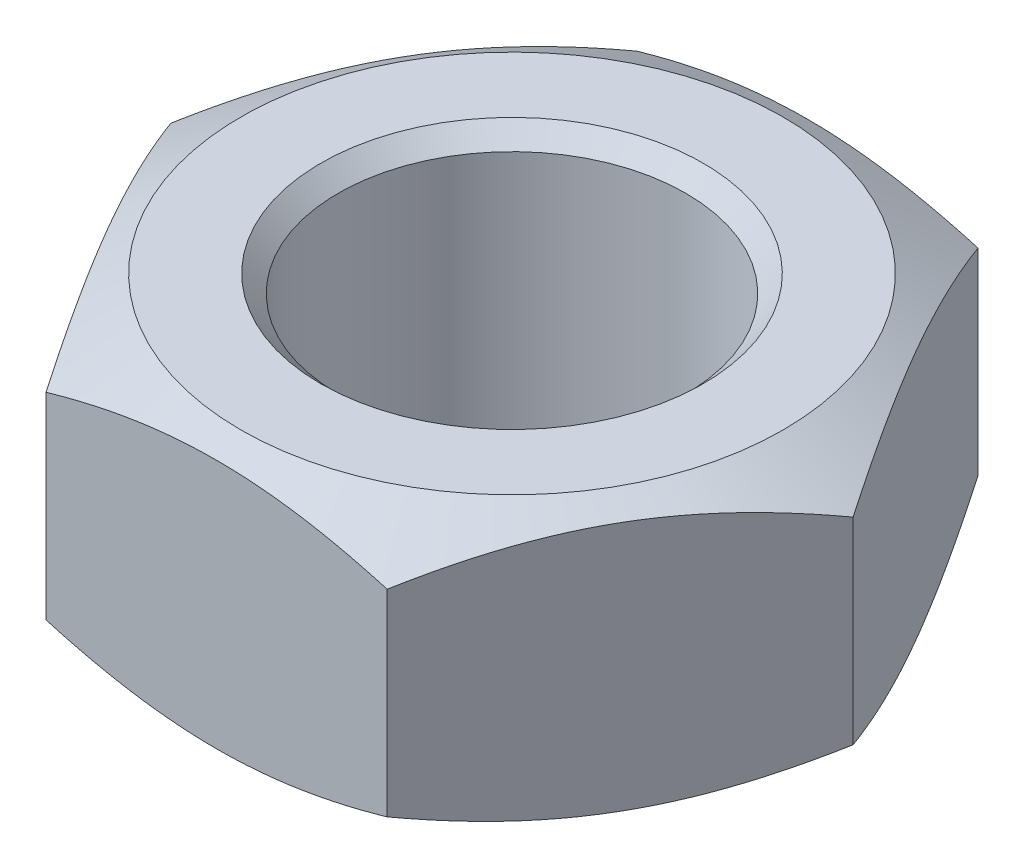
ISO-10303-21;
HEADER;
FILE_DESCRIPTION(('STEP AP214'),'2;1');
FILE_NAME('part.step','',(''),(''),'','','');
FILE_SCHEMA(('AUTOMOTIVE_DESIGN { 1 0 10303 214 1 1 1 1 }'));
ENDSEC;
DATA;
#1=APPLICATION_CONTEXT('core data for automotive mechanical design processes');
#2=APPLICATION_PROTOCOL_DEFINITION('international standard','automotive_design',2000,#1);
#3=PRODUCT_CONTEXT('',#1,'mechanical');
#4=PRODUCT('Part','Part','',(#3));
#5=PRODUCT_RELATED_PRODUCT_CATEGORY('part','',(#4));
#6=PRODUCT_DEFINITION_FORMATION('','',#4);
#7=PRODUCT_DEFINITION_CONTEXT('part definition',#1,'design');
#8=PRODUCT_DEFINITION('design','',#6,#7);
#9=PRODUCT_DEFINITION_SHAPE('','',#8);
#10=(LENGTH_UNIT() NAMED_UNIT(*) SI_UNIT(.MILLI.,.METRE.));
#11=(NAMED_UNIT(*) PLANE_ANGLE_UNIT() SI_UNIT($,.RADIAN.));
#12=(NAMED_UNIT(*) SI_UNIT($,.STERADIAN.) SOLID_ANGLE_UNIT());
#13=UNCERTAINTY_MEASURE_WITH_UNIT(LENGTH_MEASURE(1.E-05),#10,'distance_accuracy_value','');
#14=(GEOMETRIC_REPRESENTATION_CONTEXT(3) GLOBAL_UNCERTAINTY_ASSIGNED_CONTEXT((#13)) GLOBAL_UNIT_ASSIGNED_CONTEXT((#10,
#11,#12)) REPRESENTATION_CONTEXT('',''));
#15=CARTESIAN_POINT('',(0.,0.,0.));
#16=DIRECTION('',(0.,0.,1.));
#17=DIRECTION('',(1.,0.,0.));
#18=AXIS2_PLACEMENT_3D('',#15,#16,#17);
#19=CARTESIAN_POINT('',(-9.81495457622366,-8.,0.));
#20=DIRECTION('',(-0.86602540378444,0.,-0.499999999999998));
#21=DIRECTION('',(-0.499999999999998,0.,0.86602540378444));
#22=AXIS2_PLACEMENT_3D('',#19,#20,#21);
#23=PLANE('',#22);
#24=CARTESIAN_POINT('',(-9.8150700462775,-6.83659876516929,0.000200000000057371));
#25=CARTESIAN_POINT('',(-9.70719836791435,-6.89886867231834,-0.186639227622634));
#26=CARTESIAN_POINT('',(-9.59892450580108,-6.95831251581993,-0.37417505793454));
#27=CARTESIAN_POINT('',(-9.38149745632223,-7.07076970080701,-0.750769754571707));
#28=CARTESIAN_POINT('',(-9.27234391091499,-7.12378026658418,-0.939829241043311));
#29=CARTESIAN_POINT('',(-8.94313560188255,-7.27212142183681,-1.51003475856134));
#30=CARTESIAN_POINT('',(-8.72178130831641,-7.35649588362948,-1.89343164149141));
#31=CARTESIAN_POINT('',(-8.39052888726994,-7.45543479587251,-2.46717766487411));
#32=CARTESIAN_POINT('',(-8.28162036184637,-7.48361961211907,-2.65581276428513));
#33=CARTESIAN_POINT('',(-8.0633107976052,-7.53088072680106,-3.03393602132906));
#34=CARTESIAN_POINT('',(-7.9539098031659,-7.54995783001431,-3.22342410209649));
#35=CARTESIAN_POINT('',(-7.73491944569824,-7.57852003890146,-3.60272652759815));
#36=CARTESIAN_POINT('',(-7.62533043846206,-7.58801603009594,-3.79254025608224));
#37=CARTESIAN_POINT('',(-7.40605119052159,-7.59721243192821,-4.17234305456064));
#38=CARTESIAN_POINT('',(-7.2963609530496,-7.5969131452,-4.36233211895642));
#39=CARTESIAN_POINT('',(-7.0912913958101,-7.58720033599376,-4.7175230111809));
#40=CARTESIAN_POINT('',(-6.99589760406286,-7.57897164296971,-4.88274990521376));
#41=CARTESIAN_POINT('',(-6.80533344342289,-7.55526557051036,-5.21281671354391));
#42=CARTESIAN_POINT('',(-6.71016309002554,-7.53978770244847,-5.3776566010024));
#43=CARTESIAN_POINT('',(-6.42502047322662,-7.48284619070863,-5.87153810070128));
#44=CARTESIAN_POINT('',(-6.23555293555807,-7.43088175028966,-6.19970550232818));
#45=CARTESIAN_POINT('',(-5.85460803351892,-7.30096987104433,-6.85952142754434));
#46=CARTESIAN_POINT('',(-5.66317928714415,-7.22247174169523,-7.19108574229466));
#47=CARTESIAN_POINT('',(-5.28317649029224,-7.04431347159464,-7.84926989346046));
#48=CARTESIAN_POINT('',(-5.09459757358651,-6.9446951754373,-8.17589815843108));
#49=CARTESIAN_POINT('',(-4.907361818058,-6.8365987651693,-8.5002));
#50=B_SPLINE_CURVE_WITH_KNOTS('',3,(#24,#25,#26,#27,#28,#29,#30,#31,#32,#33,#34,#35,#36,#37,#38,
#39,#40,#41,#42,#43,#44,#45,#46,#47,#48,#49),.UNSPECIFIED.,.F.,.F.,(4,2,2,2,2,2,2,2,2,2,2,2,4),
(0.,0.673596396411508,1.34748239783842,2.69805431639326,3.356799954547,4.01548737369113,
4.67342558367776,5.33134346608656,5.90409556798841,6.47688628148365,7.62328361419567,
8.7951056987859,9.96462743748735),.UNSPECIFIED.);
#51=CARTESIAN_POINT('',(-9.81495457622366,-6.83666543301242,0.));
#52=VERTEX_POINT('',#51);
#53=CARTESIAN_POINT('',(-4.90747728811186,-6.83666543301242,-8.5));
#54=VERTEX_POINT('',#53);
#55=EDGE_CURVE('E152',#52,#54,#50,.T.);
#56=ORIENTED_EDGE('',*,*,#55,.F.);
#57=DIRECTION('',(0.,1.,0.));
#58=VECTOR('',#57,1.);
#59=CARTESIAN_POINT('',(-9.81495457622366,-8.,0.));
#60=LINE('',#59,#58);
#61=CARTESIAN_POINT('',(-9.81495457622366,-1.16333456698758,0.));
#62=VERTEX_POINT('',#61);
#63=EDGE_CURVE('E51',#52,#62,#60,.T.);
#64=ORIENTED_EDGE('',*,*,#63,.T.);
#65=CARTESIAN_POINT('',(-4.907361818058,-1.1634012348307,-8.5002));
#66=CARTESIAN_POINT('',(-5.01523349642114,-1.10113132768165,-8.31336077237731));
#67=CARTESIAN_POINT('',(-5.12350735853442,-1.04168748418007,-8.1258249420654));
#68=CARTESIAN_POINT('',(-5.34093440801327,-0.929230299192983,-7.74923024542824));
#69=CARTESIAN_POINT('',(-5.4500879534205,-0.876219733415814,-7.56017075895663));
#70=CARTESIAN_POINT('',(-5.77929626245295,-0.727878578163188,-6.9899652414386));
#71=CARTESIAN_POINT('',(-6.00065055601908,-0.643504116370516,-6.60656835850854));
#72=CARTESIAN_POINT('',(-6.33190297706556,-0.544565204127485,-6.03282233512584));
#73=CARTESIAN_POINT('',(-6.44081150248912,-0.516380387880928,-5.84418723571482));
#74=CARTESIAN_POINT('',(-6.65912106673029,-0.469119273198933,-5.46606397867089));
#75=CARTESIAN_POINT('',(-6.76852206116959,-0.450042169985694,-5.27657589790346));
#76=CARTESIAN_POINT('',(-6.98751241863725,-0.421479961098537,-4.8972734724018));
#77=CARTESIAN_POINT('',(-7.09710142587343,-0.411983969904065,-4.70745974391771));
#78=CARTESIAN_POINT('',(-7.3163806738139,-0.402787568071787,-4.32765694543931));
#79=CARTESIAN_POINT('',(-7.42607091128589,-0.403086854799996,-4.13766788104353));
#80=CARTESIAN_POINT('',(-7.6311404685254,-0.412799664006239,-3.78247698881905));
#81=CARTESIAN_POINT('',(-7.72653426027263,-0.421028357030291,-3.61725009478619));
#82=CARTESIAN_POINT('',(-7.91709842091261,-0.444734429489638,-3.28718328645603));
#83=CARTESIAN_POINT('',(-8.01226877430996,-0.460212297551535,-3.12234339899754));
#84=CARTESIAN_POINT('',(-8.29741139110888,-0.517153809291373,-2.62846189929867));
#85=CARTESIAN_POINT('',(-8.48687892877743,-0.569118249710342,-2.30029449767176));
#86=CARTESIAN_POINT('',(-8.86782383081658,-0.699030128955678,-1.64047857245561));
#87=CARTESIAN_POINT('',(-9.05925257719135,-0.777528258304772,-1.30891425770528));
#88=CARTESIAN_POINT('',(-9.43925537404326,-0.955686528405361,-0.650730106539489));
#89=CARTESIAN_POINT('',(-9.62783429074899,-1.05530482456271,-0.324101841568869));
#90=CARTESIAN_POINT('',(-9.8150700462775,-1.16340123483071,0.000200000000056542));
#91=B_SPLINE_CURVE_WITH_KNOTS('',3,(#65,#66,#67,#68,#69,#70,#71,#72,#73,#74,#75,#76,#77,#78,#79,
#80,#81,#82,#83,#84,#85,#86,#87,#88,#89,#90),.UNSPECIFIED.,.F.,.F.,(4,2,2,2,2,2,2,2,2,2,2,2,4),
(0.,0.673596396411507,1.34748239783841,2.69805431639326,3.35679995454699,4.01548737369113,
4.67342558367775,5.33134346608655,5.9040955679884,6.47688628148365,7.62328361419567,
8.7951056987859,9.96462743748735),.UNSPECIFIED.);
#92=CARTESIAN_POINT('',(-4.90747728811186,-1.16333456698758,-8.5));
#93=VERTEX_POINT('',#92);
#94=EDGE_CURVE('E111',#93,#62,#91,.T.);
#95=ORIENTED_EDGE('',*,*,#94,.F.);
#96=DIRECTION('',(0.,1.,0.));
#97=VECTOR('',#96,1.);
#98=CARTESIAN_POINT('',(-4.90747728811184,-8.,-8.5));
#99=LINE('',#98,#97);
#100=EDGE_CURVE('E116',#54,#93,#99,.T.);
#101=ORIENTED_EDGE('',*,*,#100,.F.);
#102=EDGE_LOOP('',(#56,#64,#95,#101));
#103=FACE_BOUND('',#102,.T.);
#104=ADVANCED_FACE('F28',(#103),#23,.T.);
#105=CARTESIAN_POINT('',(-4.90747728811184,-8.,-8.5));
#106=DIRECTION('',(0.,0.,-1.));
#107=DIRECTION('',(-1.,0.,0.));
#108=AXIS2_PLACEMENT_3D('',#105,#106,#107);
#109=PLANE('',#108);
#110=CARTESIAN_POINT('',(-12.9593811954137,-3.55541686822176,-8.5));
#111=CARTESIAN_POINT('',(-12.7730052801024,-3.6453918393162,-8.5));
#112=CARTESIAN_POINT('',(-12.5864024892101,-3.73489662843801,-8.5));
#113=CARTESIAN_POINT('',(-12.2126952107654,-3.91285778629309,-8.5));
#114=CARTESIAN_POINT('',(-12.025590717641,-4.00131414332257,-8.5));
#115=CARTESIAN_POINT('',(-11.4633970632729,-4.26497453250306,-8.5));
#116=CARTESIAN_POINT('',(-11.0874893107814,-4.43844006570839,-8.5));
#117=CARTESIAN_POINT('',(-10.3308772057093,-4.78060850012098,-8.5));
#118=CARTESIAN_POINT('',(-9.95015767762061,-4.94927793078866,-8.5));
#119=CARTESIAN_POINT('',(-9.18556933701991,-5.27929382994621,-8.5));
#120=CARTESIAN_POINT('',(-8.80170069187937,-5.44064068468202,-8.5));
#121=CARTESIAN_POINT('',(-8.02569881715882,-5.75586586182672,-8.5));
#122=CARTESIAN_POINT('',(-7.63352136661533,-5.90963592889023,-8.5));
#123=CARTESIAN_POINT('',(-6.8445219586493,-6.20499276377457,-8.5));
#124=CARTESIAN_POINT('',(-6.44769948801446,-6.34657817064144,-8.5));
#125=CARTESIAN_POINT('',(-5.64960766642234,-6.61371949813112,-8.5));
#126=CARTESIAN_POINT('',(-5.24835001704124,-6.73930999292362,-8.5));
#127=CARTESIAN_POINT('',(-4.4401476840043,-6.97034888534236,-8.5));
#128=CARTESIAN_POINT('',(-4.03320485775415,-7.07580370365054,-8.5));
#129=CARTESIAN_POINT('',(-3.21326379597259,-7.2614133340203,-8.5));
#130=CARTESIAN_POINT('',(-2.80026330009669,-7.34155843710114,-8.5));
#131=CARTESIAN_POINT('',(-2.17717665803348,-7.43874892876722,-8.5));
#132=CARTESIAN_POINT('',(-1.96885783689491,-7.46730997715133,-8.5));
#133=CARTESIAN_POINT('',(-1.55126238584584,-7.51619360333292,-8.5));
#134=CARTESIAN_POINT('',(-1.34198584829876,-7.53651695932955,-8.5));
#135=CARTESIAN_POINT('',(-0.924053900024583,-7.56838082293183,-8.5));
#136=CARTESIAN_POINT('',(-0.715402554872813,-7.57997444570745,-8.5));
#137=CARTESIAN_POINT('',(-0.297796839610766,-7.59431850671262,-8.5));
#138=CARTESIAN_POINT('',(-0.0888424740630394,-7.59706907673606,-8.5));
#139=CARTESIAN_POINT('',(0.328936821405079,-7.59366172686365,-8.5));
#140=CARTESIAN_POINT('',(0.537761771119541,-7.58750625748337,-8.5));
#141=CARTESIAN_POINT('',(0.95497241287918,-7.5664382608039,-8.5));
#142=CARTESIAN_POINT('',(1.16335808042934,-7.55152525749137,-8.5));
#143=CARTESIAN_POINT('',(1.67007705909358,-7.50492305840914,-8.5));
#144=CARTESIAN_POINT('',(1.96800623316432,-7.4687540151977,-8.5));
#145=CARTESIAN_POINT('',(2.56149280023897,-7.38054239087631,-8.5));
#146=CARTESIAN_POINT('',(2.85704982708993,-7.32849740582022,-8.5));
#147=CARTESIAN_POINT('',(3.7406969943832,-7.15116319275699,-8.5));
#148=CARTESIAN_POINT('',(4.32460385613248,-7.00479480016007,-8.5));
#149=CARTESIAN_POINT('',(5.19792071941044,-6.75288813596677,-8.5));
#150=CARTESIAN_POINT('',(5.49190536098578,-6.66231334065846,-8.5));
#151=CARTESIAN_POINT('',(6.07703460575826,-6.47224950082138,-8.5));
#152=CARTESIAN_POINT('',(6.36817895260374,-6.37275965976702,-8.5));
#153=CARTESIAN_POINT('',(6.94617309568556,-6.16698872160895,-8.5));
#154=CARTESIAN_POINT('',(7.23303787739942,-6.06074929235148,-8.5));
#155=CARTESIAN_POINT('',(7.80433444975854,-5.84219321962963,-8.5));
#156=CARTESIAN_POINT('',(8.08876704344201,-5.7298786793971,-8.5));
#157=CARTESIAN_POINT('',(8.37217691898812,-5.61509704845258,-8.5));
#158=B_SPLINE_CURVE_WITH_KNOTS('',3,(#110,#111,#112,#113,#114,#115,#116,#117,#118,#119,#120,
#121,#122,#123,#124,#125,#126,#127,#128,#129,#130,#131,#132,#133,#134,#135,#136,#137,#138,#139,
#140,#141,#142,#143,#144,#145,#146,#147,#148,#149,#150,#151,#152,#153,#154,#155,#156,#157),
.UNSPECIFIED.,.F.,.F.,(4,2,2,2,2,2,2,2,2,2,2,2,2,2,2,2,2,2,2,2,2,2,2,4),(0.,0.620871786792664,
1.2417504979445,2.48371317454651,3.73288141488301,4.98198368823383,6.24556546838778,
7.50928820041588,8.77023118755628,10.0307714226948,11.2917946239997,11.9224600677605,
12.5530659198622,13.1798032023582,13.8065311441288,14.4330866731728,15.0596762616224,
15.959513715216,16.8594874905142,18.6629162365996,19.5857095322114,20.5085853582747,
21.4262327978789,22.3435645521088),.UNSPECIFIED.);
#159=CARTESIAN_POINT('',(4.90747728811186,-6.83666543301242,-8.5));
#160=VERTEX_POINT('',#159);
#161=EDGE_CURVE('E157',#54,#160,#158,.T.);
#162=ORIENTED_EDGE('',*,*,#161,.F.);
#163=ORIENTED_EDGE('',*,*,#100,.T.);
#164=CARTESIAN_POINT('',(-12.9593811954137,-4.44458313177824,-8.5));
#165=CARTESIAN_POINT('',(-12.7730052801024,-4.3546081606838,-8.5));
#166=CARTESIAN_POINT('',(-12.5864024892101,-4.26510337156199,-8.5));
#167=CARTESIAN_POINT('',(-12.2126952107654,-4.08714221370691,-8.5));
#168=CARTESIAN_POINT('',(-12.025590717641,-3.99868585667743,-8.5));
#169=CARTESIAN_POINT('',(-11.4633970632729,-3.73502546749694,-8.5));
#170=CARTESIAN_POINT('',(-11.0874893107814,-3.5615599342916,-8.5));
#171=CARTESIAN_POINT('',(-10.3308772057093,-3.21939149987902,-8.5));
#172=CARTESIAN_POINT('',(-9.9501576776206,-3.05072206921134,-8.5));
#173=CARTESIAN_POINT('',(-9.18556933701991,-2.72070617005379,-8.5));
#174=CARTESIAN_POINT('',(-8.80170069187937,-2.55935931531799,-8.5));
#175=CARTESIAN_POINT('',(-8.02569881715882,-2.24413413817328,-8.5));
#176=CARTESIAN_POINT('',(-7.63352136661533,-2.09036407110977,-8.5));
#177=CARTESIAN_POINT('',(-6.8445219586493,-1.79500723622543,-8.5));
#178=CARTESIAN_POINT('',(-6.44769948801446,-1.65342182935856,-8.5));
#179=CARTESIAN_POINT('',(-5.64960766642234,-1.38628050186888,-8.5));
#180=CARTESIAN_POINT('',(-5.24835001704124,-1.26069000707638,-8.5));
#181=CARTESIAN_POINT('',(-4.4401476840043,-1.02965111465764,-8.5));
#182=CARTESIAN_POINT('',(-4.03320485775415,-0.924196296349462,-8.5));
#183=CARTESIAN_POINT('',(-3.21326379597259,-0.738586665979696,-8.5));
#184=CARTESIAN_POINT('',(-2.80026330009669,-0.658441562898862,-8.5));
#185=CARTESIAN_POINT('',(-2.17717665803348,-0.56125107123278,-8.5));
#186=CARTESIAN_POINT('',(-1.96885783689491,-0.532690022848673,-8.5));
#187=CARTESIAN_POINT('',(-1.55126238584584,-0.483806396667081,-8.5));
#188=CARTESIAN_POINT('',(-1.34198584829876,-0.463483040670452,-8.5));
#189=CARTESIAN_POINT('',(-0.924053900024583,-0.431619177068171,-8.5));
#190=CARTESIAN_POINT('',(-0.715402554872813,-0.42002555429255,-8.5));
#191=CARTESIAN_POINT('',(-0.297796839610766,-0.405681493287381,-8.5));
#192=CARTESIAN_POINT('',(-0.0888424740630396,-0.402930923263941,-8.5));
#193=CARTESIAN_POINT('',(0.328936821405079,-0.406338273136345,-8.5));
#194=CARTESIAN_POINT('',(0.537761771119541,-0.412493742516627,-8.5));
#195=CARTESIAN_POINT('',(0.95497241287918,-0.433561739196098,-8.5));
#196=CARTESIAN_POINT('',(1.16335808042934,-0.448474742508628,-8.5));
#197=CARTESIAN_POINT('',(1.67007705909358,-0.495076941590859,-8.5));
#198=CARTESIAN_POINT('',(1.96800623316432,-0.531245984802299,-8.5));
#199=CARTESIAN_POINT('',(2.56149280023896,-0.61945760912369,-8.5));
#200=CARTESIAN_POINT('',(2.85704982708993,-0.671502594179784,-8.5));
#201=CARTESIAN_POINT('',(3.7406969943832,-0.84883680724301,-8.5));
#202=CARTESIAN_POINT('',(4.32460385613248,-0.995205199839932,-8.5));
#203=CARTESIAN_POINT('',(5.19792071941044,-1.24711186403324,-8.5));
#204=CARTESIAN_POINT('',(5.49190536098578,-1.33768665934154,-8.5));
#205=CARTESIAN_POINT('',(6.07703460575826,-1.52775049917863,-8.5));
#206=CARTESIAN_POINT('',(6.36817895260374,-1.62724034023298,-8.5));
#207=CARTESIAN_POINT('',(6.94617309568556,-1.83301127839105,-8.5));
#208=CARTESIAN_POINT('',(7.23303787739942,-1.93925070764851,-8.5));
#209=CARTESIAN_POINT('',(7.80433444975854,-2.15780678037037,-8.5));
#210=CARTESIAN_POINT('',(8.08876704344201,-2.2701213206029,-8.5));
#211=CARTESIAN_POINT('',(8.37217691898812,-2.38490295154742,-8.5));
#212=B_SPLINE_CURVE_WITH_KNOTS('',3,(#164,#165,#166,#167,#168,#169,#170,#171,#172,#173,#174,
#175,#176,#177,#178,#179,#180,#181,#182,#183,#184,#185,#186,#187,#188,#189,#190,#191,#192,#193,
#194,#195,#196,#197,#198,#199,#200,#201,#202,#203,#204,#205,#206,#207,#208,#209,#210,#211),
.UNSPECIFIED.,.F.,.F.,(4,2,2,2,2,2,2,2,2,2,2,2,2,2,2,2,2,2,2,2,2,2,2,4),(0.,0.620871786792663,
1.2417504979445,2.48371317454651,3.73288141488301,4.98198368823383,6.24556546838778,
7.50928820041588,8.77023118755628,10.0307714226948,11.2917946239997,11.9224600677605,
12.5530659198622,13.1798032023582,13.8065311441288,14.4330866731728,15.0596762616224,
15.959513715216,16.8594874905142,18.6629162365996,19.5857095322114,20.5085853582747,
21.4262327978789,22.3435645521088),.UNSPECIFIED.);
#213=CARTESIAN_POINT('',(4.90747728811186,-1.16333456698758,-8.5));
#214=VERTEX_POINT('',#213);
#215=EDGE_CURVE('E197',#214,#93,#212,.F.);
#216=ORIENTED_EDGE('',*,*,#215,.F.);
#217=DIRECTION('',(0.,1.,0.));
#218=VECTOR('',#217,1.);
#219=CARTESIAN_POINT('',(4.90747728811186,-8.,-8.5));
#220=LINE('',#219,#218);
#221=EDGE_CURVE('E105',#160,#214,#220,.T.);
#222=ORIENTED_EDGE('',*,*,#221,.F.);
#223=EDGE_LOOP('',(#162,#163,#216,#222));
#224=FACE_BOUND('',#223,.T.);
#225=ADVANCED_FACE('F207',(#224),#109,.T.);
#226=CARTESIAN_POINT('',(4.90747728811186,-8.,-8.5));
#227=DIRECTION('',(0.866025403784441,0.,-0.499999999999996));
#228=DIRECTION('',(-0.499999999999996,0.,-0.866025403784441));
#229=AXIS2_PLACEMENT_3D('',#226,#227,#228);
#230=PLANE('',#229);
#231=CARTESIAN_POINT('',(4.90736181805802,-6.83659876516929,-8.5002));
#232=CARTESIAN_POINT('',(5.01523349642117,-6.89886867231834,-8.31336077237731));
#233=CARTESIAN_POINT('',(5.12350735853444,-6.95831251581993,-8.1258249420654));
#234=CARTESIAN_POINT('',(5.3409344080133,-7.07076970080701,-7.74923024542823));
#235=CARTESIAN_POINT('',(5.45008795342053,-7.12378026658418,-7.56017075895663));
#236=CARTESIAN_POINT('',(5.77929626245297,-7.27212142183681,-6.9899652414386));
#237=CARTESIAN_POINT('',(6.00065055601911,-7.35649588362948,-6.60656835850853));
#238=CARTESIAN_POINT('',(6.33190297706558,-7.45543479587251,-6.03282233512583));
#239=CARTESIAN_POINT('',(6.44081150248915,-7.48361961211906,-5.84418723571481));
#240=CARTESIAN_POINT('',(6.65912106673031,-7.53088072680106,-5.46606397867088));
#241=CARTESIAN_POINT('',(6.76852206116962,-7.5499578300143,-5.27657589790345));
#242=CARTESIAN_POINT('',(6.98751241863728,-7.57852003890145,-4.89727347240179));
#243=CARTESIAN_POINT('',(7.09710142587345,-7.58801603009593,-4.7074597439177));
#244=CARTESIAN_POINT('',(7.31638067381392,-7.59721243192821,-4.3276569454393));
#245=CARTESIAN_POINT('',(7.42607091128591,-7.5969131452,-4.13766788104352));
#246=CARTESIAN_POINT('',(7.63114046852542,-7.58720033599375,-3.78247698881904));
#247=CARTESIAN_POINT('',(7.72653426027265,-7.5789716429697,-3.61725009478619));
#248=CARTESIAN_POINT('',(7.91709842091262,-7.55526557051035,-3.28718328645603));
#249=CARTESIAN_POINT('',(8.01226877430997,-7.53978770244846,-3.12234339899754));
#250=CARTESIAN_POINT('',(8.29741139110889,-7.48284619070862,-2.62846189929867));
#251=CARTESIAN_POINT('',(8.48687892877744,-7.43088175028965,-2.30029449767177));
#252=CARTESIAN_POINT('',(8.86782383081658,-7.30096987104432,-1.64047857245562));
#253=CARTESIAN_POINT('',(9.05925257719135,-7.22247174169523,-1.3089142577053));
#254=CARTESIAN_POINT('',(9.43925537404326,-7.04431347159464,-0.650730106539509));
#255=CARTESIAN_POINT('',(9.62783429074899,-6.94469517543729,-0.324101841568891));
#256=CARTESIAN_POINT('',(9.81507004627749,-6.8365987651693,0.0002000000000315));
#257=B_SPLINE_CURVE_WITH_KNOTS('',3,(#231,#232,#233,#234,#235,#236,#237,#238,#239,#240,#241,
#242,#243,#244,#245,#246,#247,#248,#249,#250,#251,#252,#253,#254,#255,#256),.UNSPECIFIED.,.F.,
.F.,(4,2,2,2,2,2,2,2,2,2,2,2,4),(0.,0.673596396411509,1.34748239783842,2.69805431639326,
3.356799954547,4.01548737369113,4.67342558367776,5.33134346608656,5.9040955679884,
6.47688628148364,7.62328361419565,8.79510569878587,9.96462743748731),.UNSPECIFIED.);
#258=CARTESIAN_POINT('',(9.81495457622366,-6.83666543301242,0.));
#259=VERTEX_POINT('',#258);
#260=EDGE_CURVE('E85',#160,#259,#257,.T.);
#261=ORIENTED_EDGE('',*,*,#260,.F.);
#262=ORIENTED_EDGE('',*,*,#221,.T.);
#263=CARTESIAN_POINT('',(9.81507004627749,-1.1634012348307,0.000200000000030895));
#264=CARTESIAN_POINT('',(9.70719836791435,-1.10113132768165,-0.186639227622661));
#265=CARTESIAN_POINT('',(9.59892450580107,-1.04168748418007,-0.374175057934567));
#266=CARTESIAN_POINT('',(9.38149745632222,-0.929230299192987,-0.750769754571734));
#267=CARTESIAN_POINT('',(9.27234391091499,-0.876219733415819,-0.939829241043339));
#268=CARTESIAN_POINT('',(8.94313560188254,-0.727878578163193,-1.51003475856137));
#269=CARTESIAN_POINT('',(8.72178130831641,-0.64350411637052,-1.89343164149144));
#270=CARTESIAN_POINT('',(8.39052888726994,-0.544565204127492,-2.46717766487413));
#271=CARTESIAN_POINT('',(8.28162036184637,-0.516380387880936,-2.65581276428516));
#272=CARTESIAN_POINT('',(8.0633107976052,-0.469119273198941,-3.03393602132909));
#273=CARTESIAN_POINT('',(7.9539098031659,-0.450042169985701,-3.22342410209652));
#274=CARTESIAN_POINT('',(7.73491944569824,-0.421479961098544,-3.60272652759818));
#275=CARTESIAN_POINT('',(7.62533043846206,-0.411983969904073,-3.79254025608227));
#276=CARTESIAN_POINT('',(7.40605119052159,-0.402787568071795,-4.17234305456067));
#277=CARTESIAN_POINT('',(7.2963609530496,-0.403086854800004,-4.36233211895645));
#278=CARTESIAN_POINT('',(7.0912913958101,-0.412799664006248,-4.71752301118093));
#279=CARTESIAN_POINT('',(6.99589760406287,-0.421028357030301,-4.88274990521378));
#280=CARTESIAN_POINT('',(6.80533344342289,-0.444734429489648,-5.21281671354394));
#281=CARTESIAN_POINT('',(6.71016309002555,-0.460212297551544,-5.37765660100243));
#282=CARTESIAN_POINT('',(6.42502047322663,-0.517153809291383,-5.8715381007013));
#283=CARTESIAN_POINT('',(6.23555293555808,-0.56911824971035,-6.1997055023282));
#284=CARTESIAN_POINT('',(5.85460803351894,-0.699030128955684,-6.85952142754435));
#285=CARTESIAN_POINT('',(5.66317928714417,-0.777528258304777,-7.19108574229467));
#286=CARTESIAN_POINT('',(5.28317649029226,-0.955686528405364,-7.84926989346046));
#287=CARTESIAN_POINT('',(5.09459757358653,-1.05530482456271,-8.17589815843108));
#288=CARTESIAN_POINT('',(4.90736181805802,-1.16340123483071,-8.5002));
#289=B_SPLINE_CURVE_WITH_KNOTS('',3,(#263,#264,#265,#266,#267,#268,#269,#270,#271,#272,#273,
#274,#275,#276,#277,#278,#279,#280,#281,#282,#283,#284,#285,#286,#287,#288),.UNSPECIFIED.,.F.,
.F.,(4,2,2,2,2,2,2,2,2,2,2,2,4),(0.,0.673596396411507,1.34748239783842,2.69805431639326,
3.356799954547,4.01548737369113,4.67342558367776,5.33134346608656,5.9040955679884,
6.47688628148364,7.62328361419565,8.79510569878587,9.96462743748731),.UNSPECIFIED.);
#290=CARTESIAN_POINT('',(9.81495457622366,-1.16333456698758,0.));
#291=VERTEX_POINT('',#290);
#292=EDGE_CURVE('E191',#291,#214,#289,.T.);
#293=ORIENTED_EDGE('',*,*,#292,.F.);
#294=DIRECTION('',(0.,1.,0.));
#295=VECTOR('',#294,1.);
#296=CARTESIAN_POINT('',(9.81495457622365,-8.,0.));
#297=LINE('',#296,#295);
#298=EDGE_CURVE('E103',#259,#291,#297,.T.);
#299=ORIENTED_EDGE('',*,*,#298,.F.);
#300=EDGE_LOOP('',(#261,#262,#293,#299));
#301=FACE_BOUND('',#300,.T.);
#302=ADVANCED_FACE('F211',(#301),#230,.T.);
#303=CARTESIAN_POINT('',(9.81495457622365,-8.,0.));
#304=DIRECTION('',(0.866025403784436,0.,0.500000000000005));
#305=DIRECTION('',(0.500000000000005,0.,-0.866025403784436));
#306=AXIS2_PLACEMENT_3D('',#303,#304,#305);
#307=PLANE('',#306);
#308=CARTESIAN_POINT('',(9.81507004627749,-6.8365987651693,-0.000199999999969171));
#309=CARTESIAN_POINT('',(9.70719836791435,-6.89886867231835,0.186639227622721));
#310=CARTESIAN_POINT('',(9.59892450580107,-6.95831251581993,0.374175057934626));
#311=CARTESIAN_POINT('',(9.38149745632221,-7.07076970080702,0.750769754571791));
#312=CARTESIAN_POINT('',(9.27234391091498,-7.12378026658418,0.939829241043394));
#313=CARTESIAN_POINT('',(8.94313560188253,-7.27212142183681,1.51003475856142));
#314=CARTESIAN_POINT('',(8.72178130831639,-7.35649588362948,1.89343164149149));
#315=CARTESIAN_POINT('',(8.39052888726991,-7.45543479587251,2.46717766487418));
#316=CARTESIAN_POINT('',(8.28162036184634,-7.48361961211907,2.65581276428521));
#317=CARTESIAN_POINT('',(8.06331079760517,-7.53088072680107,3.03393602132913));
#318=CARTESIAN_POINT('',(7.95390980316587,-7.54995783001431,3.22342410209656));
#319=CARTESIAN_POINT('',(7.73491944569821,-7.57852003890147,3.60272652759822));
#320=CARTESIAN_POINT('',(7.62533043846203,-7.58801603009594,3.79254025608231));
#321=CARTESIAN_POINT('',(7.40605119052155,-7.59721243192822,4.1723430545607));
#322=CARTESIAN_POINT('',(7.29636095304956,-7.59691314520001,4.36233211895648));
#323=CARTESIAN_POINT('',(7.09129139581005,-7.58720033599376,4.71752301118096));
#324=CARTESIAN_POINT('',(6.99589760406282,-7.57897164296971,4.88274990521381));
#325=CARTESIAN_POINT('',(6.80533344342284,-7.55526557051037,5.21281671354396));
#326=CARTESIAN_POINT('',(6.7101630900255,-7.53978770244847,5.37765660100245));
#327=CARTESIAN_POINT('',(6.42502047322658,-7.48284619070863,5.87153810070132));
#328=CARTESIAN_POINT('',(6.23555293555802,-7.43088175028966,6.19970550232822));
#329=CARTESIAN_POINT('',(5.85460803351887,-7.30096987104433,6.85952142754436));
#330=CARTESIAN_POINT('',(5.6631792871441,-7.22247174169524,7.19108574229468));
#331=CARTESIAN_POINT('',(5.28317649029219,-7.04431347159465,7.84926989346047));
#332=CARTESIAN_POINT('',(5.09459757358646,-6.94469517543731,8.17589815843108));
#333=CARTESIAN_POINT('',(4.90736181805795,-6.83659876516932,8.5002));
#334=B_SPLINE_CURVE_WITH_KNOTS('',3,(#308,#309,#310,#311,#312,#313,#314,#315,#316,#317,#318,
#319,#320,#321,#322,#323,#324,#325,#326,#327,#328,#329,#330,#331,#332,#333),.UNSPECIFIED.,.F.,
.F.,(4,2,2,2,2,2,2,2,2,2,2,2,4),(0.,0.673596396411507,1.34748239783841,2.69805431639326,
3.356799954547,4.01548737369113,4.67342558367776,5.33134346608655,5.90409556798839,
6.47688628148363,7.62328361419564,8.79510569878586,9.96462743748729),.UNSPECIFIED.);
#335=CARTESIAN_POINT('',(4.90747728811186,-6.83666543301242,8.5));
#336=VERTEX_POINT('',#335);
#337=EDGE_CURVE('E81',#259,#336,#334,.T.);
#338=ORIENTED_EDGE('',*,*,#337,.F.);
#339=ORIENTED_EDGE('',*,*,#298,.T.);
#340=CARTESIAN_POINT('',(4.90736181805795,-1.16340123483068,8.5002));
#341=CARTESIAN_POINT('',(5.01523349642109,-1.10113132768164,8.31336077237731));
#342=CARTESIAN_POINT('',(5.12350735853437,-1.04168748418005,8.1258249420654));
#343=CARTESIAN_POINT('',(5.34093440801323,-0.929230299192972,7.74923024542824));
#344=CARTESIAN_POINT('',(5.45008795342046,-0.876219733415803,7.56017075895664));
#345=CARTESIAN_POINT('',(5.77929626245291,-0.727878578163177,6.98996524143861));
#346=CARTESIAN_POINT('',(6.00065055601905,-0.643504116370508,6.60656835850855));
#347=CARTESIAN_POINT('',(6.33190297706552,-0.544565204127479,6.03282233512586));
#348=CARTESIAN_POINT('',(6.44081150248909,-0.516380387880922,5.84418723571483));
#349=CARTESIAN_POINT('',(6.65912106673026,-0.469119273198928,5.46606397867091));
#350=CARTESIAN_POINT('',(6.76852206116957,-0.450042169985689,5.27657589790348));
#351=CARTESIAN_POINT('',(6.98751241863723,-0.421479961098533,4.89727347240182));
#352=CARTESIAN_POINT('',(7.09710142587341,-0.411983969904062,4.70745974391773));
#353=CARTESIAN_POINT('',(7.31638067381388,-0.402787568071785,4.32765694543934));
#354=CARTESIAN_POINT('',(7.42607091128587,-0.403086854799995,4.13766788104356));
#355=CARTESIAN_POINT('',(7.63114046852538,-0.412799664006239,3.78247698881908));
#356=CARTESIAN_POINT('',(7.72653426027261,-0.421028357030291,3.61725009478623));
#357=CARTESIAN_POINT('',(7.91709842091259,-0.444734429489639,3.28718328645608));
#358=CARTESIAN_POINT('',(8.01226877430994,-0.460212297551536,3.12234339899759));
#359=CARTESIAN_POINT('',(8.29741139110886,-0.517153809291375,2.62846189929872));
#360=CARTESIAN_POINT('',(8.48687892877742,-0.569118249710343,2.30029449767182));
#361=CARTESIAN_POINT('',(8.86782383081656,-0.699030128955677,1.64047857245567));
#362=CARTESIAN_POINT('',(9.05925257719134,-0.777528258304771,1.30891425770535));
#363=CARTESIAN_POINT('',(9.43925537404325,-0.955686528405359,0.650730106539566));
#364=CARTESIAN_POINT('',(9.62783429074898,-1.05530482456271,0.32410184156895));
#365=CARTESIAN_POINT('',(9.81507004627749,-1.1634012348307,-0.000199999999969833));
#366=B_SPLINE_CURVE_WITH_KNOTS('',3,(#340,#341,#342,#343,#344,#345,#346,#347,#348,#349,#350,
#351,#352,#353,#354,#355,#356,#357,#358,#359,#360,#361,#362,#363,#364,#365),.UNSPECIFIED.,.F.,
.F.,(4,2,2,2,2,2,2,2,2,2,2,2,4),(0.,0.673596396411506,1.34748239783841,2.69805431639325,
3.35679995454699,4.01548737369112,4.67342558367774,5.33134346608654,5.90409556798838,
6.47688628148362,7.62328361419563,8.79510569878585,9.9646274374873),.UNSPECIFIED.);
#367=CARTESIAN_POINT('',(4.90747728811186,-1.16333456698758,8.5));
#368=VERTEX_POINT('',#367);
#369=EDGE_CURVE('E102',#368,#291,#366,.T.);
#370=ORIENTED_EDGE('',*,*,#369,.F.);
#371=DIRECTION('',(0.,1.,0.));
#372=VECTOR('',#371,1.);
#373=CARTESIAN_POINT('',(4.90747728811179,-8.,8.5));
#374=LINE('',#373,#372);
#375=EDGE_CURVE('E94',#336,#368,#374,.T.);
#376=ORIENTED_EDGE('',*,*,#375,.F.);
#377=EDGE_LOOP('',(#338,#339,#370,#376));
#378=FACE_BOUND('',#377,.T.);
#379=ADVANCED_FACE('F100',(#378),#307,.T.);
#380=CARTESIAN_POINT('',(4.90747728811179,-8.,8.5));
#381=DIRECTION('',(0.,0.,1.));
#382=DIRECTION('',(1.,0.,0.));
#383=AXIS2_PLACEMENT_3D('',#380,#381,#382);
#384=PLANE('',#383);
#385=CARTESIAN_POINT('',(-12.9593811954275,-3.55541686821507,8.5));
#386=CARTESIAN_POINT('',(-12.773005280116,-3.64539183930966,8.5));
#387=CARTESIAN_POINT('',(-12.5864024892235,-3.73489662843161,8.5));
#388=CARTESIAN_POINT('',(-12.2126952107783,-3.91285778628698,8.5));
#389=CARTESIAN_POINT('',(-12.0255907176537,-4.0013141433166,8.5));
#390=CARTESIAN_POINT('',(-11.4633970632848,-4.26497453249752,8.5));
#391=CARTESIAN_POINT('',(-11.0874893107929,-4.43844006570314,8.5));
#392=CARTESIAN_POINT('',(-10.3308772057198,-4.7806085001163,8.5));
#393=CARTESIAN_POINT('',(-9.95015767763062,-4.94927793078427,8.5));
#394=CARTESIAN_POINT('',(-9.18556933702896,-5.27929382994238,8.5));
#395=CARTESIAN_POINT('',(-8.80170069188792,-5.44064068467847,8.5));
#396=CARTESIAN_POINT('',(-8.02569881716638,-5.75586586182372,8.5));
#397=CARTESIAN_POINT('',(-7.63352136662239,-5.90963592888751,8.5));
#398=CARTESIAN_POINT('',(-6.84452195865535,-6.20499276377238,8.5));
#399=CARTESIAN_POINT('',(-6.44769948802,-6.34657817063952,8.5));
#400=CARTESIAN_POINT('',(-5.64960766642685,-6.61371949812969,8.5));
#401=CARTESIAN_POINT('',(-5.24835001704523,-6.73930999292242,8.5));
#402=CARTESIAN_POINT('',(-4.44014768400724,-6.97034888534159,8.5));
#403=CARTESIAN_POINT('',(-4.03320485775655,-7.07580370364995,8.5));
#404=CARTESIAN_POINT('',(-3.21326379597363,-7.26141333402011,8.5));
#405=CARTESIAN_POINT('',(-2.80026330009689,-7.34155843710112,8.5));
#406=CARTESIAN_POINT('',(-2.17717665803242,-7.43874892876738,8.5));
#407=CARTESIAN_POINT('',(-1.96885783689342,-7.46730997715153,8.5));
#408=CARTESIAN_POINT('',(-1.55126238584349,-7.51619360333317,8.5));
#409=CARTESIAN_POINT('',(-1.34198584829599,-7.5365169593298,8.5));
#410=CARTESIAN_POINT('',(-0.924053900020958,-7.56838082293206,8.5));
#411=CARTESIAN_POINT('',(-0.715402554868763,-7.57997444570765,8.5));
#412=CARTESIAN_POINT('',(-0.297796839605869,-7.59431850671272,8.5));
#413=CARTESIAN_POINT('',(-0.088842474057719,-7.5970690767361,8.5));
#414=CARTESIAN_POINT('',(0.328936821411243,-7.59366172686352,8.5));
#415=CARTESIAN_POINT('',(0.537761771126125,-7.58750625748314,8.5));
#416=CARTESIAN_POINT('',(0.954972412886597,-7.56643826080343,8.5));
#417=CARTESIAN_POINT('',(1.16335808043717,-7.55152525749076,8.5));
#418=CARTESIAN_POINT('',(1.67007705910207,-7.5049230584082,8.5));
#419=CARTESIAN_POINT('',(1.96800623317307,-7.46875401519656,8.5));
#420=CARTESIAN_POINT('',(2.5614928002482,-7.38054239087477,8.5));
#421=CARTESIAN_POINT('',(2.8570498270994,-7.32849740581848,8.5));
#422=CARTESIAN_POINT('',(3.74069699439337,-7.15116319275463,8.5));
#423=CARTESIAN_POINT('',(4.3246038561431,-7.00479480015729,8.5));
#424=CARTESIAN_POINT('',(5.19792071942173,-6.75288813596336,8.5));
#425=CARTESIAN_POINT('',(5.4919053609973,-6.66231334065485,8.5));
#426=CARTESIAN_POINT('',(6.07703460577023,-6.47224950081735,8.5));
#427=CARTESIAN_POINT('',(6.36817895261594,-6.37275965976279,8.5));
#428=CARTESIAN_POINT('',(6.9461730956982,-6.16698872160433,8.5));
#429=CARTESIAN_POINT('',(7.23303787741229,-6.06074929234667,8.5));
#430=CARTESIAN_POINT('',(7.80433444977186,-5.84219321962443,8.5));
#431=CARTESIAN_POINT('',(8.08876704345554,-5.72987867939171,8.5));
#432=CARTESIAN_POINT('',(8.37217691900188,-5.61509704844701,8.5));
#433=B_SPLINE_CURVE_WITH_KNOTS('',3,(#385,#386,#387,#388,#389,#390,#391,#392,#393,#394,#395,
#396,#397,#398,#399,#400,#401,#402,#403,#404,#405,#406,#407,#408,#409,#410,#411,#412,#413,#414,
#415,#416,#417,#418,#419,#420,#421,#422,#423,#424,#425,#426,#427,#428,#429,#430,#431,#432),
.UNSPECIFIED.,.F.,.F.,(4,2,2,2,2,2,2,2,2,2,2,2,2,2,2,2,2,2,2,2,2,2,2,4),(0.,0.620871786793494,
1.24175049794616,2.48371317454983,3.73288141488802,4.98198368824051,6.24556546839616,
7.50928820042596,8.77023118756806,10.0307714227082,11.2917946240157,11.9224600677778,
12.5530659198808,13.1798032023781,13.8065311441499,14.4330866731952,15.059676261646,
15.9595137152405,16.8594874905395,18.6629162366265,19.5857095322391,20.5085853583032,
21.4262327979083,22.343564552139),.UNSPECIFIED.);
#434=CARTESIAN_POINT('',(-4.90747728811176,-6.83666543301245,8.5));
#435=VERTEX_POINT('',#434);
#436=EDGE_CURVE('E43',#336,#435,#433,.F.);
#437=ORIENTED_EDGE('',*,*,#436,.F.);
#438=ORIENTED_EDGE('',*,*,#375,.T.);
#439=CARTESIAN_POINT('',(-12.9593811954275,-4.44458313178493,8.5));
#440=CARTESIAN_POINT('',(-12.773005280116,-4.35460816069034,8.5));
#441=CARTESIAN_POINT('',(-12.5864024892235,-4.26510337156839,8.5));
#442=CARTESIAN_POINT('',(-12.2126952107783,-4.08714221371302,8.5));
#443=CARTESIAN_POINT('',(-12.0255907176537,-3.9986858566834,8.5));
#444=CARTESIAN_POINT('',(-11.4633970632848,-3.73502546750248,8.5));
#445=CARTESIAN_POINT('',(-11.0874893107929,-3.56155993429686,8.5));
#446=CARTESIAN_POINT('',(-10.3308772057198,-3.2193914998837,8.5));
#447=CARTESIAN_POINT('',(-9.95015767763062,-3.05072206921573,8.5));
#448=CARTESIAN_POINT('',(-9.18556933702896,-2.72070617005762,8.5));
#449=CARTESIAN_POINT('',(-8.80170069188792,-2.55935931532154,8.5));
#450=CARTESIAN_POINT('',(-8.02569881716639,-2.24413413817628,8.5));
#451=CARTESIAN_POINT('',(-7.6335213666224,-2.09036407111249,8.5));
#452=CARTESIAN_POINT('',(-6.84452195865535,-1.79500723622762,8.5));
#453=CARTESIAN_POINT('',(-6.44769948802,-1.65342182936048,8.5));
#454=CARTESIAN_POINT('',(-5.64960766642685,-1.38628050187031,8.5));
#455=CARTESIAN_POINT('',(-5.24835001704523,-1.26069000707758,8.5));
#456=CARTESIAN_POINT('',(-4.44014768400723,-1.02965111465841,8.5));
#457=CARTESIAN_POINT('',(-4.03320485775655,-0.924196296350046,8.5));
#458=CARTESIAN_POINT('',(-3.21326379597363,-0.73858666597989,8.5));
#459=CARTESIAN_POINT('',(-2.80026330009689,-0.658441562898877,8.5));
#460=CARTESIAN_POINT('',(-2.17717665803241,-0.561251071232622,8.5));
#461=CARTESIAN_POINT('',(-1.96885783689342,-0.532690022848473,8.5));
#462=CARTESIAN_POINT('',(-1.55126238584349,-0.483806396666832,8.5));
#463=CARTESIAN_POINT('',(-1.34198584829598,-0.463483040670197,8.5));
#464=CARTESIAN_POINT('',(-0.924053900020956,-0.431619177067939,8.5));
#465=CARTESIAN_POINT('',(-0.715402554868761,-0.420025554292348,8.5));
#466=CARTESIAN_POINT('',(-0.297796839605868,-0.405681493287276,8.5));
#467=CARTESIAN_POINT('',(-0.0888424740577176,-0.402930923263904,8.5));
#468=CARTESIAN_POINT('',(0.328936821411244,-0.406338273136477,8.5));
#469=CARTESIAN_POINT('',(0.537761771126125,-0.412493742516862,8.5));
#470=CARTESIAN_POINT('',(0.954972412886597,-0.433561739196571,8.5));
#471=CARTESIAN_POINT('',(1.16335808043717,-0.448474742509236,8.5));
#472=CARTESIAN_POINT('',(1.67007705910207,-0.495076941591802,8.5));
#473=CARTESIAN_POINT('',(1.96800623317307,-0.531245984803436,8.5));
#474=CARTESIAN_POINT('',(2.56149280024819,-0.619457609125226,8.5));
#475=CARTESIAN_POINT('',(2.85704982709939,-0.671502594181524,8.5));
#476=CARTESIAN_POINT('',(3.74069699439336,-0.84883680724537,8.5));
#477=CARTESIAN_POINT('',(4.3246038561431,-0.995205199842712,8.5));
#478=CARTESIAN_POINT('',(5.19792071942173,-1.24711186403664,8.5));
#479=CARTESIAN_POINT('',(5.4919053609973,-1.33768665934515,8.5));
#480=CARTESIAN_POINT('',(6.07703460577023,-1.52775049918264,8.5));
#481=CARTESIAN_POINT('',(6.36817895261593,-1.62724034023721,8.5));
#482=CARTESIAN_POINT('',(6.9461730956982,-1.83301127839567,8.5));
#483=CARTESIAN_POINT('',(7.23303787741228,-1.93925070765333,8.5));
#484=CARTESIAN_POINT('',(7.80433444977185,-2.15780678037557,8.5));
#485=CARTESIAN_POINT('',(8.08876704345554,-2.27012132060829,8.5));
#486=CARTESIAN_POINT('',(8.37217691900187,-2.38490295155299,8.5));
#487=B_SPLINE_CURVE_WITH_KNOTS('',3,(#439,#440,#441,#442,#443,#444,#445,#446,#447,#448,#449,
#450,#451,#452,#453,#454,#455,#456,#457,#458,#459,#460,#461,#462,#463,#464,#465,#466,#467,#468,
#469,#470,#471,#472,#473,#474,#475,#476,#477,#478,#479,#480,#481,#482,#483,#484,#485,#486),
.UNSPECIFIED.,.F.,.F.,(4,2,2,2,2,2,2,2,2,2,2,2,2,2,2,2,2,2,2,2,2,2,2,4),(0.,0.620871786793494,
1.24175049794616,2.48371317454983,3.73288141488801,4.9819836882405,6.24556546839616,
7.50928820042596,8.77023118756806,10.0307714227082,11.2917946240157,11.9224600677778,
12.5530659198808,13.1798032023781,13.8065311441499,14.4330866731952,15.059676261646,
15.9595137152404,16.8594874905395,18.6629162366265,19.5857095322391,20.5085853583032,
21.4262327979083,22.343564552139),.UNSPECIFIED.);
#488=CARTESIAN_POINT('',(-4.90747728811172,-1.16333456698758,8.50000000000008));
#489=VERTEX_POINT('',#488);
#490=EDGE_CURVE('E155',#489,#368,#487,.T.);
#491=ORIENTED_EDGE('',*,*,#490,.F.);
#492=DIRECTION('',(0.,1.,0.));
#493=VECTOR('',#492,1.);
#494=CARTESIAN_POINT('',(-4.90747728811176,-8.,8.5));
#495=LINE('',#494,#493);
#496=EDGE_CURVE('E96',#435,#489,#495,.T.);
#497=ORIENTED_EDGE('',*,*,#496,.F.);
#498=EDGE_LOOP('',(#437,#438,#491,#497));
#499=FACE_BOUND('',#498,.T.);
#500=ADVANCED_FACE('F92',(#499),#384,.T.);
#501=CARTESIAN_POINT('',(-4.90747728811176,-8.,8.5));
#502=DIRECTION('',(-0.866025403784434,0.,0.500000000000008));
#503=DIRECTION('',(0.500000000000008,0.,0.866025403784434));
#504=AXIS2_PLACEMENT_3D('',#501,#502,#503);
#505=PLANE('',#504);
#506=CARTESIAN_POINT('',(-4.90736181805793,-6.83659876516932,8.5002));
#507=CARTESIAN_POINT('',(-5.01523349642107,-6.89886867231837,8.31336077237731));
#508=CARTESIAN_POINT('',(-5.12350735853435,-6.95831251581995,8.12582494206541));
#509=CARTESIAN_POINT('',(-5.34093440801321,-7.07076970080703,7.74923024542825));
#510=CARTESIAN_POINT('',(-5.45008795342044,-7.1237802665842,7.56017075895664));
#511=CARTESIAN_POINT('',(-5.77929626245289,-7.27212142183683,6.98996524143862));
#512=CARTESIAN_POINT('',(-6.00065055601903,-7.3564958836295,6.60656835850855));
#513=CARTESIAN_POINT('',(-6.33190297706551,-7.45543479587252,6.03282233512587));
#514=CARTESIAN_POINT('',(-6.44081150248908,-7.48361961211908,5.84418723571484));
#515=CARTESIAN_POINT('',(-6.65912106673025,-7.53088072680107,5.46606397867092));
#516=CARTESIAN_POINT('',(-6.76852206116955,-7.54995783001431,5.27657589790349));
#517=CARTESIAN_POINT('',(-6.98751241863722,-7.57852003890147,4.89727347240183));
#518=CARTESIAN_POINT('',(-7.0971014258734,-7.58801603009594,4.70745974391774));
#519=CARTESIAN_POINT('',(-7.31638067381387,-7.59721243192822,4.32765694543936));
#520=CARTESIAN_POINT('',(-7.42607091128587,-7.59691314520001,4.13766788104357));
#521=CARTESIAN_POINT('',(-7.63114046852537,-7.58720033599376,3.7824769888191));
#522=CARTESIAN_POINT('',(-7.72653426027261,-7.57897164296971,3.61725009478625));
#523=CARTESIAN_POINT('',(-7.91709842091259,-7.55526557051036,3.28718328645609));
#524=CARTESIAN_POINT('',(-8.01226877430994,-7.53978770244846,3.12234339899761));
#525=CARTESIAN_POINT('',(-8.29741139110886,-7.48284619070862,2.62846189929874));
#526=CARTESIAN_POINT('',(-8.48687892877741,-7.43088175028966,2.30029449767184));
#527=CARTESIAN_POINT('',(-8.86782383081657,-7.30096987104432,1.64047857245569));
#528=CARTESIAN_POINT('',(-9.05925257719134,-7.22247174169523,1.30891425770537));
#529=CARTESIAN_POINT('',(-9.43925537404326,-7.04431347159464,0.650730106539592));
#530=CARTESIAN_POINT('',(-9.62783429074899,-6.94469517543729,0.324101841568977));
#531=CARTESIAN_POINT('',(-9.8150700462775,-6.83659876516929,-0.000199999999943215));
#532=B_SPLINE_CURVE_WITH_KNOTS('',3,(#506,#507,#508,#509,#510,#511,#512,#513,#514,#515,#516,
#517,#518,#519,#520,#521,#522,#523,#524,#525,#526,#527,#528,#529,#530,#531),.UNSPECIFIED.,.F.,
.F.,(4,2,2,2,2,2,2,2,2,2,2,2,4),(0.,0.673596396411505,1.34748239783841,2.69805431639325,
3.35679995454698,4.01548737369111,4.67342558367774,5.33134346608653,5.90409556798838,
6.47688628148362,7.62328361419563,8.79510569878584,9.96462743748729),.UNSPECIFIED.);
#533=EDGE_CURVE('E97',#435,#52,#532,.T.);
#534=ORIENTED_EDGE('',*,*,#533,.F.);
#535=ORIENTED_EDGE('',*,*,#496,.T.);
#536=CARTESIAN_POINT('',(-9.8150700462775,-1.16340123483071,-0.000199999999942754));
#537=CARTESIAN_POINT('',(-9.70719836791435,-1.10113132768166,0.186639227622747));
#538=CARTESIAN_POINT('',(-9.59892450580107,-1.04168748418007,0.374175057934652));
#539=CARTESIAN_POINT('',(-9.38149745632222,-0.929230299192988,0.750769754571816));
#540=CARTESIAN_POINT('',(-9.27234391091498,-0.876219733415819,0.93982924104342));
#541=CARTESIAN_POINT('',(-8.94313560188253,-0.727878578163191,1.51003475856145));
#542=CARTESIAN_POINT('',(-8.72178130831639,-0.643504116370518,1.89343164149151));
#543=CARTESIAN_POINT('',(-8.39052888726991,-0.544565204127487,2.4671776648742));
#544=CARTESIAN_POINT('',(-8.28162036184634,-0.51638038788093,2.65581276428523));
#545=CARTESIAN_POINT('',(-8.06331079760517,-0.469119273198935,3.03393602132915));
#546=CARTESIAN_POINT('',(-7.95390980316586,-0.450042169985695,3.22342410209658));
#547=CARTESIAN_POINT('',(-7.7349194456982,-0.421479961098536,3.60272652759824));
#548=CARTESIAN_POINT('',(-7.62533043846202,-0.411983969904064,3.79254025608233));
#549=CARTESIAN_POINT('',(-7.40605119052154,-0.402787568071785,4.17234305456072));
#550=CARTESIAN_POINT('',(-7.29636095304955,-0.403086854799993,4.3623321189565));
#551=CARTESIAN_POINT('',(-7.09129139581004,-0.412799664006237,4.71752301118098));
#552=CARTESIAN_POINT('',(-6.99589760406281,-0.421028357030289,4.88274990521383));
#553=CARTESIAN_POINT('',(-6.80533344342283,-0.444734429489634,5.21281671354398));
#554=CARTESIAN_POINT('',(-6.71016309002548,-0.46021229755153,5.37765660100247));
#555=CARTESIAN_POINT('',(-6.42502047322656,-0.517153809291367,5.87153810070133));
#556=CARTESIAN_POINT('',(-6.23555293555801,-0.569118249710333,6.19970550232823));
#557=CARTESIAN_POINT('',(-5.85460803351886,-0.699030128955664,6.85952142754437));
#558=CARTESIAN_POINT('',(-5.66317928714408,-0.777528258304755,7.19108574229469));
#559=CARTESIAN_POINT('',(-5.28317649029216,-0.95568652840534,7.84926989346047));
#560=CARTESIAN_POINT('',(-5.09459757358644,-1.05530482456268,8.17589815843109));
#561=CARTESIAN_POINT('',(-4.90736181805793,-1.16340123483068,8.5002));
#562=B_SPLINE_CURVE_WITH_KNOTS('',3,(#536,#537,#538,#539,#540,#541,#542,#543,#544,#545,#546,
#547,#548,#549,#550,#551,#552,#553,#554,#555,#556,#557,#558,#559,#560,#561),.UNSPECIFIED.,.F.,
.F.,(4,2,2,2,2,2,2,2,2,2,2,2,4),(0.,0.673596396411509,1.34748239783842,2.69805431639326,
3.356799954547,4.01548737369113,4.67342558367776,5.33134346608656,5.9040955679884,
6.47688628148364,7.62328361419564,8.79510569878585,9.96462743748729),.UNSPECIFIED.);
#563=EDGE_CURVE('E151',#62,#489,#562,.T.);
#564=ORIENTED_EDGE('',*,*,#563,.F.);
#565=ORIENTED_EDGE('',*,*,#63,.F.);
#566=EDGE_LOOP('',(#534,#535,#564,#565));
#567=FACE_BOUND('',#566,.T.);
#568=ADVANCED_FACE('F174',(#567),#505,.T.);
#569=CARTESIAN_POINT('',(-9.81495457622366,-8.,0.));
#570=DIRECTION('',(0.,1.,0.));
#571=DIRECTION('',(0.,0.,1.));
#572=AXIS2_PLACEMENT_3D('',#569,#570,#571);
#573=PLANE('',#572);
#574=CARTESIAN_POINT('',(0.,-8.,0.));
#575=DIRECTION('',(0.,1.,0.));
#576=DIRECTION('',(0.,0.,1.));
#577=AXIS2_PLACEMENT_3D('',#574,#575,#576);
#578=CIRCLE('',#577,5.49999999999999);
#579=CARTESIAN_POINT('',(0.,-8.,5.49999999999999));
#580=VERTEX_POINT('',#579);
#581=EDGE_CURVE('E36',#580,#580,#578,.T.);
#582=ORIENTED_EDGE('',*,*,#581,.T.);
#583=EDGE_LOOP('',(#582));
#584=FACE_BOUND('',#583,.T.);
#585=CARTESIAN_POINT('',(0.,-8.,0.));
#586=DIRECTION('',(0.,1.,0.));
#587=DIRECTION('',(0.,0.,1.));
#588=AXIS2_PLACEMENT_3D('',#585,#586,#587);
#589=CIRCLE('',#588,7.8);
#590=CARTESIAN_POINT('',(0.,-8.,7.8));
#591=VERTEX_POINT('',#590);
#592=EDGE_CURVE('E301',#591,#591,#589,.T.);
#593=ORIENTED_EDGE('',*,*,#592,.F.);
#594=EDGE_LOOP('',(#593));
#595=FACE_BOUND('',#594,.T.);
#596=ADVANCED_FACE('F121',(#584,#595),#573,.F.);
#597=CARTESIAN_POINT('',(-9.81495457622366,0.,0.));
#598=DIRECTION('',(0.,1.,0.));
#599=DIRECTION('',(0.,0.,1.));
#600=AXIS2_PLACEMENT_3D('',#597,#598,#599);
#601=PLANE('',#600);
#602=CARTESIAN_POINT('',(0.,0.,0.));
#603=DIRECTION('',(0.,1.,0.));
#604=DIRECTION('',(0.,0.,1.));
#605=AXIS2_PLACEMENT_3D('',#602,#603,#604);
#606=CIRCLE('',#605,5.5);
#607=CARTESIAN_POINT('',(0.,0.,5.5));
#608=VERTEX_POINT('',#607);
#609=EDGE_CURVE('E11',#608,#608,#606,.F.);
#610=ORIENTED_EDGE('',*,*,#609,.T.);
#611=EDGE_LOOP('',(#610));
#612=FACE_BOUND('',#611,.T.);
#613=CARTESIAN_POINT('',(0.,0.,0.));
#614=DIRECTION('',(0.,1.,0.));
#615=DIRECTION('',(0.,0.,1.));
#616=AXIS2_PLACEMENT_3D('',#613,#614,#615);
#617=CIRCLE('',#616,7.8);
#618=CARTESIAN_POINT('',(0.,0.,7.8));
#619=VERTEX_POINT('',#618);
#620=EDGE_CURVE('E149',#619,#619,#617,.T.);
#621=ORIENTED_EDGE('',*,*,#620,.T.);
#622=EDGE_LOOP('',(#621));
#623=FACE_BOUND('',#622,.T.);
#624=ADVANCED_FACE('F135',(#612,#623),#601,.T.);
#625=CARTESIAN_POINT('',(0.,0.,0.));
#626=DIRECTION('',(0.,-1.,0.));
#627=DIRECTION('',(0.,0.,-1.));
#628=AXIS2_PLACEMENT_3D('',#625,#626,#627);
#629=CYLINDRICAL_SURFACE('',#628,5.);
#630=CARTESIAN_POINT('',(0.,-7.50000000000001,0.));
#631=DIRECTION('',(0.,1.,0.));
#632=DIRECTION('',(0.,0.,1.));
#633=AXIS2_PLACEMENT_3D('',#630,#631,#632);
#634=CIRCLE('',#633,5.);
#635=CARTESIAN_POINT('',(0.,-7.50000000000001,5.));
#636=VERTEX_POINT('',#635);
#637=EDGE_CURVE('E115',#636,#636,#634,.F.);
#638=ORIENTED_EDGE('',*,*,#637,.T.);
#639=EDGE_LOOP('',(#638));
#640=FACE_BOUND('',#639,.T.);
#641=CARTESIAN_POINT('',(0.,-0.5,0.));
#642=DIRECTION('',(0.,1.,0.));
#643=DIRECTION('',(0.,0.,1.));
#644=AXIS2_PLACEMENT_3D('',#641,#642,#643);
#645=CIRCLE('',#644,5.);
#646=CARTESIAN_POINT('',(0.,-0.5,5.));
#647=VERTEX_POINT('',#646);
#648=EDGE_CURVE('E112',#647,#647,#645,.T.);
#649=ORIENTED_EDGE('',*,*,#648,.T.);
#650=EDGE_LOOP('',(#649));
#651=FACE_BOUND('',#650,.T.);
#652=ADVANCED_FACE('F131',(#640,#651),#629,.F.);
#653=CARTESIAN_POINT('',(0.,-1.16333456698758,0.));
#654=DIRECTION('',(0.,-1.,0.));
#655=DIRECTION('',(0.,0.,-1.));
#656=AXIS2_PLACEMENT_3D('',#653,#654,#655);
#657=CONICAL_SURFACE('',#656,9.81495457622366,1.0471975511966);
#658=ORIENTED_EDGE('',*,*,#94,.T.);
#659=ORIENTED_EDGE('',*,*,#563,.T.);
#660=ORIENTED_EDGE('',*,*,#490,.T.);
#661=ORIENTED_EDGE('',*,*,#369,.T.);
#662=ORIENTED_EDGE('',*,*,#292,.T.);
#663=ORIENTED_EDGE('',*,*,#215,.T.);
#664=EDGE_LOOP('',(#658,#659,#660,#661,#662,#663));
#665=FACE_BOUND('',#664,.T.);
#666=ORIENTED_EDGE('',*,*,#620,.F.);
#667=EDGE_LOOP('',(#666));
#668=FACE_BOUND('',#667,.T.);
#669=ADVANCED_FACE('F134',(#665,#668),#657,.T.);
#670=CARTESIAN_POINT('',(0.,-8.,0.));
#671=DIRECTION('',(0.,1.,0.));
#672=DIRECTION('',(0.,0.,1.));
#673=AXIS2_PLACEMENT_3D('',#670,#671,#672);
#674=CONICAL_SURFACE('',#673,7.8,1.0471975511966);
#675=ORIENTED_EDGE('',*,*,#55,.T.);
#676=ORIENTED_EDGE('',*,*,#161,.T.);
#677=ORIENTED_EDGE('',*,*,#260,.T.);
#678=ORIENTED_EDGE('',*,*,#337,.T.);
#679=ORIENTED_EDGE('',*,*,#436,.T.);
#680=ORIENTED_EDGE('',*,*,#533,.T.);
#681=EDGE_LOOP('',(#675,#676,#677,#678,#679,#680));
#682=FACE_BOUND('',#681,.T.);
#683=ORIENTED_EDGE('',*,*,#592,.T.);
#684=EDGE_LOOP('',(#683));
#685=FACE_BOUND('',#684,.T.);
#686=ADVANCED_FACE('F82',(#682,#685),#674,.T.);
#687=CARTESIAN_POINT('',(0.,-7.50000000000001,0.));
#688=DIRECTION('',(0.,-1.,0.));
#689=DIRECTION('',(0.,0.,-1.));
#690=AXIS2_PLACEMENT_3D('',#687,#688,#689);
#691=CONICAL_SURFACE('',#690,5.,0.785398163397449);
#692=ORIENTED_EDGE('',*,*,#581,.F.);
#693=EDGE_LOOP('',(#692));
#694=FACE_BOUND('',#693,.T.);
#695=ORIENTED_EDGE('',*,*,#637,.F.);
#696=EDGE_LOOP('',(#695));
#697=FACE_BOUND('',#696,.T.);
#698=ADVANCED_FACE('F124',(#694,#697),#691,.F.);
#699=CARTESIAN_POINT('',(0.,0.,0.));
#700=DIRECTION('',(0.,1.,0.));
#701=DIRECTION('',(0.,0.,1.));
#702=AXIS2_PLACEMENT_3D('',#699,#700,#701);
#703=CONICAL_SURFACE('',#702,5.5,0.785398163397446);
#704=ORIENTED_EDGE('',*,*,#648,.F.);
#705=EDGE_LOOP('',(#704));
#706=FACE_BOUND('',#705,.T.);
#707=ORIENTED_EDGE('',*,*,#609,.F.);
#708=EDGE_LOOP('',(#707));
#709=FACE_BOUND('',#708,.T.);
#710=ADVANCED_FACE('F127',(#706,#709),#703,.F.);
#711=CLOSED_SHELL('',(#104,#225,#302,#379,#500,#568,#596,#624,#652,#669,#686,#698,#710));
#712=MANIFOLD_SOLID_BREP('B2',#711);
#713=ADVANCED_BREP_SHAPE_REPRESENTATION('',(#18,#712),#14);
#714=SHAPE_DEFINITION_REPRESENTATION(#9,#713);
ENDSEC;
END-ISO-10303-21;
